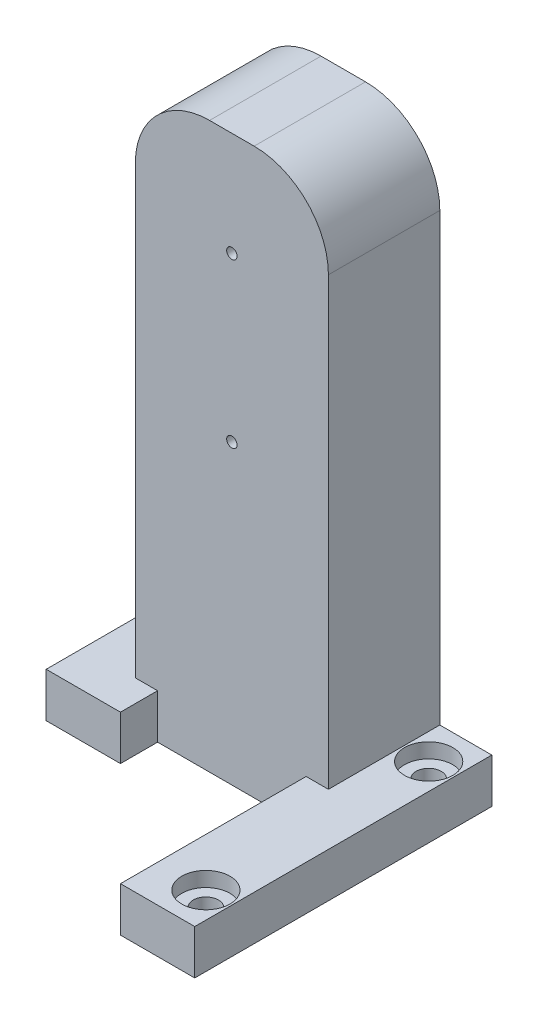
ISO-10303-21;
HEADER;
FILE_DESCRIPTION(('STEP AP214'),'2;1');
FILE_NAME('part.step','',(''),(''),'','','');
FILE_SCHEMA(('AUTOMOTIVE_DESIGN { 1 0 10303 214 1 1 1 1 }'));
ENDSEC;
DATA;
#1=APPLICATION_CONTEXT('core data for automotive mechanical design processes');
#2=APPLICATION_PROTOCOL_DEFINITION('international standard','automotive_design',2000,#1);
#3=PRODUCT_CONTEXT('',#1,'mechanical');
#4=PRODUCT('Part','Part','',(#3));
#5=PRODUCT_RELATED_PRODUCT_CATEGORY('part','',(#4));
#6=PRODUCT_DEFINITION_FORMATION('','',#4);
#7=PRODUCT_DEFINITION_CONTEXT('part definition',#1,'design');
#8=PRODUCT_DEFINITION('design','',#6,#7);
#9=PRODUCT_DEFINITION_SHAPE('','',#8);
#10=(LENGTH_UNIT() NAMED_UNIT(*) SI_UNIT(.MILLI.,.METRE.));
#11=(NAMED_UNIT(*) PLANE_ANGLE_UNIT() SI_UNIT($,.RADIAN.));
#12=(NAMED_UNIT(*) SI_UNIT($,.STERADIAN.) SOLID_ANGLE_UNIT());
#13=UNCERTAINTY_MEASURE_WITH_UNIT(LENGTH_MEASURE(1.E-05),#10,'distance_accuracy_value','');
#14=(GEOMETRIC_REPRESENTATION_CONTEXT(3) GLOBAL_UNCERTAINTY_ASSIGNED_CONTEXT((#13)) GLOBAL_UNIT_ASSIGNED_CONTEXT((#10,
#11,#12)) REPRESENTATION_CONTEXT('',''));
#15=CARTESIAN_POINT('',(0.,0.,0.));
#16=DIRECTION('',(0.,0.,1.));
#17=DIRECTION('',(1.,0.,0.));
#18=AXIS2_PLACEMENT_3D('',#15,#16,#17);
#19=CARTESIAN_POINT('',(-20.,0.,15.));
#20=DIRECTION('',(1.,0.,0.));
#21=DIRECTION('',(0.,0.,-1.));
#22=AXIS2_PLACEMENT_3D('',#19,#20,#21);
#23=PLANE('',#22);
#24=DIRECTION('',(0.,-1.,0.));
#25=VECTOR('',#24,1.);
#26=CARTESIAN_POINT('',(-20.,0.,0.));
#27=LINE('',#26,#25);
#28=CARTESIAN_POINT('',(-20.,6.,0.));
#29=VERTEX_POINT('',#28);
#30=CARTESIAN_POINT('',(-20.,0.,0.));
#31=VERTEX_POINT('',#30);
#32=EDGE_CURVE('E222',#29,#31,#27,.T.);
#33=ORIENTED_EDGE('',*,*,#32,.T.);
#34=DIRECTION('',(0.,0.,-1.));
#35=VECTOR('',#34,1.);
#36=CARTESIAN_POINT('',(-20.,0.,15.));
#37=LINE('',#36,#35);
#38=CARTESIAN_POINT('',(-20.,0.,20.));
#39=VERTEX_POINT('',#38);
#40=EDGE_CURVE('E201',#39,#31,#37,.T.);
#41=ORIENTED_EDGE('',*,*,#40,.F.);
#42=DIRECTION('',(0.,-1.,0.));
#43=VECTOR('',#42,1.);
#44=CARTESIAN_POINT('',(-20.,6.,20.));
#45=LINE('',#44,#43);
#46=CARTESIAN_POINT('',(-20.,6.,20.));
#47=VERTEX_POINT('',#46);
#48=EDGE_CURVE('E218',#47,#39,#45,.T.);
#49=ORIENTED_EDGE('',*,*,#48,.F.);
#50=DIRECTION('',(0.,0.,-1.));
#51=VECTOR('',#50,1.);
#52=CARTESIAN_POINT('',(-20.,6.,15.));
#53=LINE('',#52,#51);
#54=EDGE_CURVE('E242',#47,#29,#53,.T.);
#55=ORIENTED_EDGE('',*,*,#54,.T.);
#56=EDGE_LOOP('',(#33,#41,#49,#55));
#57=FACE_BOUND('',#56,.T.);
#58=ADVANCED_FACE('F39',(#57),#23,.F.);
#59=CARTESIAN_POINT('',(20.,0.,15.));
#60=DIRECTION('',(0.,1.,0.));
#61=DIRECTION('',(-1.,0.,0.));
#62=AXIS2_PLACEMENT_3D('',#59,#60,#61);
#63=PLANE('',#62);
#64=CARTESIAN_POINT('',(-16.5,0.,5.));
#65=DIRECTION('',(0.,1.,0.));
#66=DIRECTION('',(0.,0.,1.));
#67=AXIS2_PLACEMENT_3D('',#64,#65,#66);
#68=CIRCLE('',#67,1.70000000000001);
#69=CARTESIAN_POINT('',(-16.5,0.,6.70000000000001));
#70=VERTEX_POINT('',#69);
#71=EDGE_CURVE('E458',#70,#70,#68,.T.);
#72=ORIENTED_EDGE('',*,*,#71,.T.);
#73=EDGE_LOOP('',(#72));
#74=FACE_BOUND('',#73,.T.);
#75=CARTESIAN_POINT('',(16.5,0.,5.));
#76=DIRECTION('',(0.,1.,0.));
#77=DIRECTION('',(0.,0.,1.));
#78=AXIS2_PLACEMENT_3D('',#75,#76,#77);
#79=CIRCLE('',#78,1.70000000000001);
#80=CARTESIAN_POINT('',(16.5,0.,6.70000000000001));
#81=VERTEX_POINT('',#80);
#82=EDGE_CURVE('E442',#81,#81,#79,.T.);
#83=ORIENTED_EDGE('',*,*,#82,.T.);
#84=EDGE_LOOP('',(#83));
#85=FACE_BOUND('',#84,.T.);
#86=CARTESIAN_POINT('',(16.5,0.,35.));
#87=DIRECTION('',(0.,1.,0.));
#88=DIRECTION('',(0.,0.,1.));
#89=AXIS2_PLACEMENT_3D('',#86,#87,#88);
#90=CIRCLE('',#89,1.70000000000001);
#91=CARTESIAN_POINT('',(16.5,0.,36.7));
#92=VERTEX_POINT('',#91);
#93=EDGE_CURVE('E426',#92,#92,#90,.T.);
#94=ORIENTED_EDGE('',*,*,#93,.T.);
#95=EDGE_LOOP('',(#94));
#96=FACE_BOUND('',#95,.T.);
#97=DIRECTION('',(1.,0.,0.));
#98=VECTOR('',#97,1.);
#99=CARTESIAN_POINT('',(20.,0.,0.));
#100=LINE('',#99,#98);
#101=CARTESIAN_POINT('',(20.,0.,0.));
#102=VERTEX_POINT('',#101);
#103=EDGE_CURVE('E246',#31,#102,#100,.T.);
#104=ORIENTED_EDGE('',*,*,#103,.T.);
#105=DIRECTION('',(0.,0.,-1.));
#106=VECTOR('',#105,1.);
#107=CARTESIAN_POINT('',(20.,0.,15.));
#108=LINE('',#107,#106);
#109=CARTESIAN_POINT('',(20.,0.,40.));
#110=VERTEX_POINT('',#109);
#111=EDGE_CURVE('E155',#110,#102,#108,.T.);
#112=ORIENTED_EDGE('',*,*,#111,.F.);
#113=DIRECTION('',(-1.,0.,0.));
#114=VECTOR('',#113,1.);
#115=CARTESIAN_POINT('',(20.,0.,40.));
#116=LINE('',#115,#114);
#117=CARTESIAN_POINT('',(10.,0.,40.));
#118=VERTEX_POINT('',#117);
#119=EDGE_CURVE('E163',#110,#118,#116,.T.);
#120=ORIENTED_EDGE('',*,*,#119,.T.);
#121=DIRECTION('',(0.,0.,-1.));
#122=VECTOR('',#121,1.);
#123=CARTESIAN_POINT('',(10.,0.,40.));
#124=LINE('',#123,#122);
#125=CARTESIAN_POINT('',(10.,0.,15.));
#126=VERTEX_POINT('',#125);
#127=EDGE_CURVE('E174',#118,#126,#124,.T.);
#128=ORIENTED_EDGE('',*,*,#127,.T.);
#129=DIRECTION('',(1.,0.,0.));
#130=VECTOR('',#129,1.);
#131=CARTESIAN_POINT('',(0.,0.,15.));
#132=LINE('',#131,#130);
#133=CARTESIAN_POINT('',(-10.,0.,15.));
#134=VERTEX_POINT('',#133);
#135=EDGE_CURVE('E229',#134,#126,#132,.T.);
#136=ORIENTED_EDGE('',*,*,#135,.F.);
#137=DIRECTION('',(0.,0.,1.));
#138=VECTOR('',#137,1.);
#139=CARTESIAN_POINT('',(-10.,0.,15.));
#140=LINE('',#139,#138);
#141=CARTESIAN_POINT('',(-10.,0.,20.));
#142=VERTEX_POINT('',#141);
#143=EDGE_CURVE('E193',#134,#142,#140,.T.);
#144=ORIENTED_EDGE('',*,*,#143,.T.);
#145=DIRECTION('',(-1.,0.,0.));
#146=VECTOR('',#145,1.);
#147=CARTESIAN_POINT('',(-20.,0.,20.));
#148=LINE('',#147,#146);
#149=EDGE_CURVE('E207',#142,#39,#148,.T.);
#150=ORIENTED_EDGE('',*,*,#149,.T.);
#151=ORIENTED_EDGE('',*,*,#40,.T.);
#152=EDGE_LOOP('',(#104,#112,#120,#128,#136,#144,#150,#151));
#153=FACE_BOUND('',#152,.T.);
#154=ADVANCED_FACE('F323',(#74,#85,#96,#153),#63,.F.);
#155=CARTESIAN_POINT('',(20.,6.,15.));
#156=DIRECTION('',(-1.,0.,0.));
#157=DIRECTION('',(0.,0.,1.));
#158=AXIS2_PLACEMENT_3D('',#155,#156,#157);
#159=PLANE('',#158);
#160=DIRECTION('',(0.,1.,0.));
#161=VECTOR('',#160,1.);
#162=CARTESIAN_POINT('',(20.,6.,0.));
#163=LINE('',#162,#161);
#164=CARTESIAN_POINT('',(20.,6.,0.));
#165=VERTEX_POINT('',#164);
#166=EDGE_CURVE('E150',#102,#165,#163,.T.);
#167=ORIENTED_EDGE('',*,*,#166,.T.);
#168=DIRECTION('',(0.,0.,-1.));
#169=VECTOR('',#168,1.);
#170=CARTESIAN_POINT('',(20.,6.,15.));
#171=LINE('',#170,#169);
#172=CARTESIAN_POINT('',(20.,6.,40.));
#173=VERTEX_POINT('',#172);
#174=EDGE_CURVE('E143',#173,#165,#171,.T.);
#175=ORIENTED_EDGE('',*,*,#174,.F.);
#176=DIRECTION('',(0.,-1.,0.));
#177=VECTOR('',#176,1.);
#178=CARTESIAN_POINT('',(20.,6.,40.));
#179=LINE('',#178,#177);
#180=EDGE_CURVE('E147',#173,#110,#179,.T.);
#181=ORIENTED_EDGE('',*,*,#180,.T.);
#182=ORIENTED_EDGE('',*,*,#111,.T.);
#183=EDGE_LOOP('',(#167,#175,#181,#182));
#184=FACE_BOUND('',#183,.T.);
#185=ADVANCED_FACE('F145',(#184),#159,.F.);
#186=CARTESIAN_POINT('',(13.,6.,15.));
#187=DIRECTION('',(0.,-1.,0.));
#188=DIRECTION('',(1.,0.,0.));
#189=AXIS2_PLACEMENT_3D('',#186,#187,#188);
#190=PLANE('',#189);
#191=CARTESIAN_POINT('',(16.5,5.99999999999999,5.));
#192=DIRECTION('',(0.,1.,0.));
#193=DIRECTION('',(0.,0.,1.));
#194=AXIS2_PLACEMENT_3D('',#191,#192,#193);
#195=CIRCLE('',#194,3.25);
#196=CARTESIAN_POINT('',(16.5,5.99999999999999,8.25));
#197=VERTEX_POINT('',#196);
#198=EDGE_CURVE('E454',#197,#197,#195,.T.);
#199=ORIENTED_EDGE('',*,*,#198,.F.);
#200=EDGE_LOOP('',(#199));
#201=FACE_BOUND('',#200,.T.);
#202=CARTESIAN_POINT('',(16.5,5.99999999999999,35.));
#203=DIRECTION('',(0.,1.,0.));
#204=DIRECTION('',(0.,0.,1.));
#205=AXIS2_PLACEMENT_3D('',#202,#203,#204);
#206=CIRCLE('',#205,3.25);
#207=CARTESIAN_POINT('',(16.5,5.99999999999999,38.25));
#208=VERTEX_POINT('',#207);
#209=EDGE_CURVE('E438',#208,#208,#206,.T.);
#210=ORIENTED_EDGE('',*,*,#209,.F.);
#211=EDGE_LOOP('',(#210));
#212=FACE_BOUND('',#211,.T.);
#213=DIRECTION('',(-1.,0.,0.));
#214=VECTOR('',#213,1.);
#215=CARTESIAN_POINT('',(13.,6.,0.));
#216=LINE('',#215,#214);
#217=CARTESIAN_POINT('',(13.,6.,0.));
#218=VERTEX_POINT('',#217);
#219=EDGE_CURVE('E251',#165,#218,#216,.T.);
#220=ORIENTED_EDGE('',*,*,#219,.T.);
#221=DIRECTION('',(0.,0.,-1.));
#222=VECTOR('',#221,1.);
#223=CARTESIAN_POINT('',(13.,6.,15.));
#224=LINE('',#223,#222);
#225=CARTESIAN_POINT('',(13.,6.,15.));
#226=VERTEX_POINT('',#225);
#227=EDGE_CURVE('E156',#226,#218,#224,.T.);
#228=ORIENTED_EDGE('',*,*,#227,.F.);
#229=DIRECTION('',(1.,0.,0.));
#230=VECTOR('',#229,1.);
#231=CARTESIAN_POINT('',(20.,6.,15.));
#232=LINE('',#231,#230);
#233=CARTESIAN_POINT('',(10.,6.,15.));
#234=VERTEX_POINT('',#233);
#235=EDGE_CURVE('E166',#234,#226,#232,.T.);
#236=ORIENTED_EDGE('',*,*,#235,.F.);
#237=DIRECTION('',(0.,0.,-1.));
#238=VECTOR('',#237,1.);
#239=CARTESIAN_POINT('',(10.,6.,40.));
#240=LINE('',#239,#238);
#241=CARTESIAN_POINT('',(10.,6.,40.));
#242=VERTEX_POINT('',#241);
#243=EDGE_CURVE('E172',#242,#234,#240,.T.);
#244=ORIENTED_EDGE('',*,*,#243,.F.);
#245=DIRECTION('',(-1.,0.,0.));
#246=VECTOR('',#245,1.);
#247=CARTESIAN_POINT('',(20.,6.,40.));
#248=LINE('',#247,#246);
#249=EDGE_CURVE('E161',#173,#242,#248,.T.);
#250=ORIENTED_EDGE('',*,*,#249,.F.);
#251=ORIENTED_EDGE('',*,*,#174,.T.);
#252=EDGE_LOOP('',(#220,#228,#236,#244,#250,#251));
#253=FACE_BOUND('',#252,.T.);
#254=ADVANCED_FACE('F169',(#201,#212,#253),#190,.F.);
#255=CARTESIAN_POINT('',(13.,76.,15.));
#256=DIRECTION('',(-1.,0.,0.));
#257=DIRECTION('',(0.,-1.,0.));
#258=AXIS2_PLACEMENT_3D('',#255,#256,#257);
#259=PLANE('',#258);
#260=DIRECTION('',(0.,1.,0.));
#261=VECTOR('',#260,1.);
#262=CARTESIAN_POINT('',(13.,76.,0.));
#263=LINE('',#262,#261);
#264=CARTESIAN_POINT('',(13.,66.,0.));
#265=VERTEX_POINT('',#264);
#266=EDGE_CURVE('E254',#218,#265,#263,.T.);
#267=ORIENTED_EDGE('',*,*,#266,.T.);
#268=DIRECTION('',(0.,0.,-1.));
#269=VECTOR('',#268,1.);
#270=CARTESIAN_POINT('',(13.,66.,15.));
#271=LINE('',#270,#269);
#272=CARTESIAN_POINT('',(13.,66.,15.));
#273=VERTEX_POINT('',#272);
#274=EDGE_CURVE('E11',#265,#273,#271,.F.);
#275=ORIENTED_EDGE('',*,*,#274,.T.);
#276=DIRECTION('',(0.,1.,0.));
#277=VECTOR('',#276,1.);
#278=CARTESIAN_POINT('',(13.,76.,15.));
#279=LINE('',#278,#277);
#280=EDGE_CURVE('E232',#226,#273,#279,.T.);
#281=ORIENTED_EDGE('',*,*,#280,.F.);
#282=ORIENTED_EDGE('',*,*,#227,.T.);
#283=EDGE_LOOP('',(#267,#275,#281,#282));
#284=FACE_BOUND('',#283,.T.);
#285=ADVANCED_FACE('F319',(#284),#259,.F.);
#286=CARTESIAN_POINT('',(-13.,76.,15.));
#287=DIRECTION('',(0.,-1.,0.));
#288=DIRECTION('',(0.,0.,-1.));
#289=AXIS2_PLACEMENT_3D('',#286,#287,#288);
#290=PLANE('',#289);
#291=DIRECTION('',(-1.,0.,0.));
#292=VECTOR('',#291,1.);
#293=CARTESIAN_POINT('',(-13.,76.,0.));
#294=LINE('',#293,#292);
#295=CARTESIAN_POINT('',(2.99999999999999,76.,0.));
#296=VERTEX_POINT('',#295);
#297=CARTESIAN_POINT('',(-3.,76.,0.));
#298=VERTEX_POINT('',#297);
#299=EDGE_CURVE('E257',#296,#298,#294,.T.);
#300=ORIENTED_EDGE('',*,*,#299,.T.);
#301=DIRECTION('',(0.,0.,-1.));
#302=VECTOR('',#301,1.);
#303=CARTESIAN_POINT('',(-3.,76.,15.));
#304=LINE('',#303,#302);
#305=CARTESIAN_POINT('',(-3.,76.,15.));
#306=VERTEX_POINT('',#305);
#307=EDGE_CURVE('E61',#298,#306,#304,.F.);
#308=ORIENTED_EDGE('',*,*,#307,.T.);
#309=DIRECTION('',(-1.,0.,0.));
#310=VECTOR('',#309,1.);
#311=CARTESIAN_POINT('',(-13.,76.,15.));
#312=LINE('',#311,#310);
#313=CARTESIAN_POINT('',(2.99999999999999,76.,15.));
#314=VERTEX_POINT('',#313);
#315=EDGE_CURVE('E236',#314,#306,#312,.T.);
#316=ORIENTED_EDGE('',*,*,#315,.F.);
#317=DIRECTION('',(0.,0.,-1.));
#318=VECTOR('',#317,1.);
#319=CARTESIAN_POINT('',(2.99999999999999,76.,15.));
#320=LINE('',#319,#318);
#321=EDGE_CURVE('E289',#314,#296,#320,.T.);
#322=ORIENTED_EDGE('',*,*,#321,.T.);
#323=EDGE_LOOP('',(#300,#308,#316,#322));
#324=FACE_BOUND('',#323,.T.);
#325=ADVANCED_FACE('F314',(#324),#290,.F.);
#326=CARTESIAN_POINT('',(-13.,6.,15.));
#327=DIRECTION('',(1.,0.,0.));
#328=DIRECTION('',(0.,0.,-1.));
#329=AXIS2_PLACEMENT_3D('',#326,#327,#328);
#330=PLANE('',#329);
#331=DIRECTION('',(0.,-1.,0.));
#332=VECTOR('',#331,1.);
#333=CARTESIAN_POINT('',(-13.,6.,15.));
#334=LINE('',#333,#332);
#335=CARTESIAN_POINT('',(-13.,66.,15.));
#336=VERTEX_POINT('',#335);
#337=CARTESIAN_POINT('',(-13.,6.,15.));
#338=VERTEX_POINT('',#337);
#339=EDGE_CURVE('E239',#336,#338,#334,.T.);
#340=ORIENTED_EDGE('',*,*,#339,.F.);
#341=DIRECTION('',(0.,0.,-1.));
#342=VECTOR('',#341,1.);
#343=CARTESIAN_POINT('',(-13.,66.,15.));
#344=LINE('',#343,#342);
#345=CARTESIAN_POINT('',(-13.,66.,0.));
#346=VERTEX_POINT('',#345);
#347=EDGE_CURVE('E200',#336,#346,#344,.T.);
#348=ORIENTED_EDGE('',*,*,#347,.T.);
#349=DIRECTION('',(0.,-1.,0.));
#350=VECTOR('',#349,1.);
#351=CARTESIAN_POINT('',(-13.,6.,0.));
#352=LINE('',#351,#350);
#353=CARTESIAN_POINT('',(-13.,6.,0.));
#354=VERTEX_POINT('',#353);
#355=EDGE_CURVE('E260',#346,#354,#352,.T.);
#356=ORIENTED_EDGE('',*,*,#355,.T.);
#357=DIRECTION('',(0.,0.,-1.));
#358=VECTOR('',#357,1.);
#359=CARTESIAN_POINT('',(-13.,6.,15.));
#360=LINE('',#359,#358);
#361=EDGE_CURVE('E268',#338,#354,#360,.T.);
#362=ORIENTED_EDGE('',*,*,#361,.F.);
#363=EDGE_LOOP('',(#340,#348,#356,#362));
#364=FACE_BOUND('',#363,.T.);
#365=ADVANCED_FACE('F307',(#364),#330,.F.);
#366=CARTESIAN_POINT('',(-20.,6.,15.));
#367=DIRECTION('',(0.,-1.,0.));
#368=DIRECTION('',(1.,0.,0.));
#369=AXIS2_PLACEMENT_3D('',#366,#367,#368);
#370=PLANE('',#369);
#371=CARTESIAN_POINT('',(-16.5,6.,5.));
#372=DIRECTION('',(0.,1.,0.));
#373=DIRECTION('',(0.,0.,1.));
#374=AXIS2_PLACEMENT_3D('',#371,#372,#373);
#375=CIRCLE('',#374,3.25);
#376=CARTESIAN_POINT('',(-16.5,6.,8.25));
#377=VERTEX_POINT('',#376);
#378=EDGE_CURVE('E470',#377,#377,#375,.T.);
#379=ORIENTED_EDGE('',*,*,#378,.F.);
#380=EDGE_LOOP('',(#379));
#381=FACE_BOUND('',#380,.T.);
#382=DIRECTION('',(-1.,0.,0.));
#383=VECTOR('',#382,1.);
#384=CARTESIAN_POINT('',(-20.,6.,0.));
#385=LINE('',#384,#383);
#386=EDGE_CURVE('E233',#354,#29,#385,.T.);
#387=ORIENTED_EDGE('',*,*,#386,.T.);
#388=ORIENTED_EDGE('',*,*,#54,.F.);
#389=DIRECTION('',(-1.,0.,0.));
#390=VECTOR('',#389,1.);
#391=CARTESIAN_POINT('',(-20.,6.,20.));
#392=LINE('',#391,#390);
#393=CARTESIAN_POINT('',(-10.,6.,20.));
#394=VERTEX_POINT('',#393);
#395=EDGE_CURVE('E206',#394,#47,#392,.T.);
#396=ORIENTED_EDGE('',*,*,#395,.F.);
#397=DIRECTION('',(0.,0.,1.));
#398=VECTOR('',#397,1.);
#399=CARTESIAN_POINT('',(-10.,6.,15.));
#400=LINE('',#399,#398);
#401=CARTESIAN_POINT('',(-10.,6.,15.));
#402=VERTEX_POINT('',#401);
#403=EDGE_CURVE('E202',#402,#394,#400,.T.);
#404=ORIENTED_EDGE('',*,*,#403,.F.);
#405=DIRECTION('',(1.,0.,0.));
#406=VECTOR('',#405,1.);
#407=CARTESIAN_POINT('',(-20.,6.,15.));
#408=LINE('',#407,#406);
#409=EDGE_CURVE('E196',#338,#402,#408,.T.);
#410=ORIENTED_EDGE('',*,*,#409,.F.);
#411=ORIENTED_EDGE('',*,*,#361,.T.);
#412=EDGE_LOOP('',(#387,#388,#396,#404,#410,#411));
#413=FACE_BOUND('',#412,.T.);
#414=ADVANCED_FACE('F329',(#381,#413),#370,.F.);
#415=CARTESIAN_POINT('',(0.,0.,15.));
#416=DIRECTION('',(0.,0.,-1.));
#417=DIRECTION('',(-1.,0.,0.));
#418=AXIS2_PLACEMENT_3D('',#415,#416,#417);
#419=PLANE('',#418);
#420=CARTESIAN_POINT('',(0.,62.,15.));
#421=DIRECTION('',(0.,0.,1.));
#422=DIRECTION('',(1.,0.,0.));
#423=AXIS2_PLACEMENT_3D('',#420,#421,#422);
#424=CIRCLE('',#423,0.699999999999998);
#425=CARTESIAN_POINT('',(0.7,62.,15.));
#426=VERTEX_POINT('',#425);
#427=EDGE_CURVE('E420',#426,#426,#424,.T.);
#428=ORIENTED_EDGE('',*,*,#427,.F.);
#429=EDGE_LOOP('',(#428));
#430=FACE_BOUND('',#429,.T.);
#431=CARTESIAN_POINT('',(0.,40.,15.));
#432=DIRECTION('',(0.,0.,1.));
#433=DIRECTION('',(1.,0.,0.));
#434=AXIS2_PLACEMENT_3D('',#431,#432,#433);
#435=CIRCLE('',#434,0.699999999999998);
#436=CARTESIAN_POINT('',(0.700000000000003,40.,15.));
#437=VERTEX_POINT('',#436);
#438=EDGE_CURVE('E413',#437,#437,#435,.T.);
#439=ORIENTED_EDGE('',*,*,#438,.F.);
#440=EDGE_LOOP('',(#439));
#441=FACE_BOUND('',#440,.T.);
#442=ORIENTED_EDGE('',*,*,#315,.T.);
#443=CARTESIAN_POINT('',(-3.,66.,15.));
#444=DIRECTION('',(0.,0.,-1.));
#445=DIRECTION('',(-1.,0.,0.));
#446=AXIS2_PLACEMENT_3D('',#443,#444,#445);
#447=CIRCLE('',#446,10.);
#448=EDGE_CURVE('E48',#306,#336,#447,.F.);
#449=ORIENTED_EDGE('',*,*,#448,.T.);
#450=ORIENTED_EDGE('',*,*,#339,.T.);
#451=ORIENTED_EDGE('',*,*,#409,.T.);
#452=DIRECTION('',(0.,-1.,0.));
#453=VECTOR('',#452,1.);
#454=CARTESIAN_POINT('',(-10.,6.,15.));
#455=LINE('',#454,#453);
#456=EDGE_CURVE('E211',#402,#134,#455,.T.);
#457=ORIENTED_EDGE('',*,*,#456,.T.);
#458=ORIENTED_EDGE('',*,*,#135,.T.);
#459=DIRECTION('',(0.,-1.,0.));
#460=VECTOR('',#459,1.);
#461=CARTESIAN_POINT('',(10.,6.,15.));
#462=LINE('',#461,#460);
#463=EDGE_CURVE('E189',#234,#126,#462,.T.);
#464=ORIENTED_EDGE('',*,*,#463,.F.);
#465=ORIENTED_EDGE('',*,*,#235,.T.);
#466=ORIENTED_EDGE('',*,*,#280,.T.);
#467=CARTESIAN_POINT('',(2.99999999999999,66.,15.));
#468=DIRECTION('',(0.,0.,-1.));
#469=DIRECTION('',(-1.,0.,0.));
#470=AXIS2_PLACEMENT_3D('',#467,#468,#469);
#471=CIRCLE('',#470,10.);
#472=EDGE_CURVE('E295',#273,#314,#471,.F.);
#473=ORIENTED_EDGE('',*,*,#472,.T.);
#474=EDGE_LOOP('',(#442,#449,#450,#451,#457,#458,#464,#465,#466,#473));
#475=FACE_BOUND('',#474,.T.);
#476=ADVANCED_FACE('F301',(#430,#441,#475),#419,.F.);
#477=CARTESIAN_POINT('',(0.,0.,0.));
#478=DIRECTION('',(0.,0.,-1.));
#479=DIRECTION('',(-1.,0.,0.));
#480=AXIS2_PLACEMENT_3D('',#477,#478,#479);
#481=PLANE('',#480);
#482=CARTESIAN_POINT('',(0.,62.,0.));
#483=DIRECTION('',(0.,0.,1.));
#484=DIRECTION('',(1.,0.,0.));
#485=AXIS2_PLACEMENT_3D('',#482,#483,#484);
#486=CIRCLE('',#485,0.699999999999996);
#487=CARTESIAN_POINT('',(0.699999999999998,62.,0.));
#488=VERTEX_POINT('',#487);
#489=EDGE_CURVE('E416',#488,#488,#486,.T.);
#490=ORIENTED_EDGE('',*,*,#489,.T.);
#491=EDGE_LOOP('',(#490));
#492=FACE_BOUND('',#491,.T.);
#493=CARTESIAN_POINT('',(0.,40.,0.));
#494=DIRECTION('',(0.,0.,1.));
#495=DIRECTION('',(1.,0.,0.));
#496=AXIS2_PLACEMENT_3D('',#493,#494,#495);
#497=CIRCLE('',#496,0.699999999999996);
#498=CARTESIAN_POINT('',(0.700000000000001,40.,0.));
#499=VERTEX_POINT('',#498);
#500=EDGE_CURVE('E182',#499,#499,#497,.T.);
#501=ORIENTED_EDGE('',*,*,#500,.T.);
#502=EDGE_LOOP('',(#501));
#503=FACE_BOUND('',#502,.T.);
#504=ORIENTED_EDGE('',*,*,#355,.F.);
#505=CARTESIAN_POINT('',(-3.,66.,0.));
#506=DIRECTION('',(0.,0.,-1.));
#507=DIRECTION('',(-1.,0.,0.));
#508=AXIS2_PLACEMENT_3D('',#505,#506,#507);
#509=CIRCLE('',#508,10.);
#510=EDGE_CURVE('E286',#346,#298,#509,.T.);
#511=ORIENTED_EDGE('',*,*,#510,.T.);
#512=ORIENTED_EDGE('',*,*,#299,.F.);
#513=CARTESIAN_POINT('',(2.99999999999999,66.,0.));
#514=DIRECTION('',(0.,0.,-1.));
#515=DIRECTION('',(-1.,0.,0.));
#516=AXIS2_PLACEMENT_3D('',#513,#514,#515);
#517=CIRCLE('',#516,10.);
#518=EDGE_CURVE('E283',#296,#265,#517,.T.);
#519=ORIENTED_EDGE('',*,*,#518,.T.);
#520=ORIENTED_EDGE('',*,*,#266,.F.);
#521=ORIENTED_EDGE('',*,*,#219,.F.);
#522=ORIENTED_EDGE('',*,*,#166,.F.);
#523=ORIENTED_EDGE('',*,*,#103,.F.);
#524=ORIENTED_EDGE('',*,*,#32,.F.);
#525=ORIENTED_EDGE('',*,*,#386,.F.);
#526=EDGE_LOOP('',(#504,#511,#512,#519,#520,#521,#522,#523,#524,#525));
#527=FACE_BOUND('',#526,.T.);
#528=ADVANCED_FACE('F312',(#492,#503,#527),#481,.T.);
#529=CARTESIAN_POINT('',(-20.,6.,20.));
#530=DIRECTION('',(0.,0.,1.));
#531=DIRECTION('',(1.,0.,0.));
#532=AXIS2_PLACEMENT_3D('',#529,#530,#531);
#533=PLANE('',#532);
#534=ORIENTED_EDGE('',*,*,#149,.F.);
#535=DIRECTION('',(0.,-1.,0.));
#536=VECTOR('',#535,1.);
#537=CARTESIAN_POINT('',(-10.,6.,20.));
#538=LINE('',#537,#536);
#539=EDGE_CURVE('E223',#394,#142,#538,.T.);
#540=ORIENTED_EDGE('',*,*,#539,.F.);
#541=ORIENTED_EDGE('',*,*,#395,.T.);
#542=ORIENTED_EDGE('',*,*,#48,.T.);
#543=EDGE_LOOP('',(#534,#540,#541,#542));
#544=FACE_BOUND('',#543,.T.);
#545=ADVANCED_FACE('F345',(#544),#533,.T.);
#546=CARTESIAN_POINT('',(-10.,6.,15.));
#547=DIRECTION('',(1.,0.,0.));
#548=DIRECTION('',(0.,1.,0.));
#549=AXIS2_PLACEMENT_3D('',#546,#547,#548);
#550=PLANE('',#549);
#551=ORIENTED_EDGE('',*,*,#143,.F.);
#552=ORIENTED_EDGE('',*,*,#456,.F.);
#553=ORIENTED_EDGE('',*,*,#403,.T.);
#554=ORIENTED_EDGE('',*,*,#539,.T.);
#555=EDGE_LOOP('',(#551,#552,#553,#554));
#556=FACE_BOUND('',#555,.T.);
#557=ADVANCED_FACE('F337',(#556),#550,.T.);
#558=CARTESIAN_POINT('',(10.,6.,40.));
#559=DIRECTION('',(-1.,0.,0.));
#560=DIRECTION('',(0.,-1.,0.));
#561=AXIS2_PLACEMENT_3D('',#558,#559,#560);
#562=PLANE('',#561);
#563=ORIENTED_EDGE('',*,*,#127,.F.);
#564=DIRECTION('',(0.,-1.,0.));
#565=VECTOR('',#564,1.);
#566=CARTESIAN_POINT('',(10.,6.,40.));
#567=LINE('',#566,#565);
#568=EDGE_CURVE('E165',#242,#118,#567,.T.);
#569=ORIENTED_EDGE('',*,*,#568,.F.);
#570=ORIENTED_EDGE('',*,*,#243,.T.);
#571=ORIENTED_EDGE('',*,*,#463,.T.);
#572=EDGE_LOOP('',(#563,#569,#570,#571));
#573=FACE_BOUND('',#572,.T.);
#574=ADVANCED_FACE('F335',(#573),#562,.T.);
#575=CARTESIAN_POINT('',(20.,6.,40.));
#576=DIRECTION('',(0.,0.,1.));
#577=DIRECTION('',(1.,0.,0.));
#578=AXIS2_PLACEMENT_3D('',#575,#576,#577);
#579=PLANE('',#578);
#580=ORIENTED_EDGE('',*,*,#119,.F.);
#581=ORIENTED_EDGE('',*,*,#180,.F.);
#582=ORIENTED_EDGE('',*,*,#249,.T.);
#583=ORIENTED_EDGE('',*,*,#568,.T.);
#584=EDGE_LOOP('',(#580,#581,#582,#583));
#585=FACE_BOUND('',#584,.T.);
#586=ADVANCED_FACE('F160',(#585),#579,.T.);
#587=CARTESIAN_POINT('',(0.,40.,15.));
#588=DIRECTION('',(0.,0.,1.));
#589=DIRECTION('',(1.,0.,0.));
#590=AXIS2_PLACEMENT_3D('',#587,#588,#589);
#591=CYLINDRICAL_SURFACE('',#590,0.699999999999997);
#592=ORIENTED_EDGE('',*,*,#500,.F.);
#593=EDGE_LOOP('',(#592));
#594=FACE_BOUND('',#593,.T.);
#595=ORIENTED_EDGE('',*,*,#438,.T.);
#596=EDGE_LOOP('',(#595));
#597=FACE_BOUND('',#596,.T.);
#598=ADVANCED_FACE('F343',(#594,#597),#591,.F.);
#599=CARTESIAN_POINT('',(0.,62.,15.));
#600=DIRECTION('',(0.,0.,1.));
#601=DIRECTION('',(1.,0.,0.));
#602=AXIS2_PLACEMENT_3D('',#599,#600,#601);
#603=CYLINDRICAL_SURFACE('',#602,0.699999999999997);
#604=ORIENTED_EDGE('',*,*,#489,.F.);
#605=EDGE_LOOP('',(#604));
#606=FACE_BOUND('',#605,.T.);
#607=ORIENTED_EDGE('',*,*,#427,.T.);
#608=EDGE_LOOP('',(#607));
#609=FACE_BOUND('',#608,.T.);
#610=ADVANCED_FACE('F400',(#606,#609),#603,.F.);
#611=CARTESIAN_POINT('',(16.5,5.99999999999999,35.));
#612=DIRECTION('',(0.,1.,0.));
#613=DIRECTION('',(0.,0.,1.));
#614=AXIS2_PLACEMENT_3D('',#611,#612,#613);
#615=CYLINDRICAL_SURFACE('',#614,1.70000000000001);
#616=ORIENTED_EDGE('',*,*,#93,.F.);
#617=EDGE_LOOP('',(#616));
#618=FACE_BOUND('',#617,.T.);
#619=CARTESIAN_POINT('',(16.5,3.99999999999999,35.));
#620=DIRECTION('',(0.,1.,0.));
#621=DIRECTION('',(0.,0.,1.));
#622=AXIS2_PLACEMENT_3D('',#619,#620,#621);
#623=CIRCLE('',#622,1.7);
#624=CARTESIAN_POINT('',(16.5,3.99999999999999,36.7));
#625=VERTEX_POINT('',#624);
#626=EDGE_CURVE('E430',#625,#625,#623,.T.);
#627=ORIENTED_EDGE('',*,*,#626,.T.);
#628=EDGE_LOOP('',(#627));
#629=FACE_BOUND('',#628,.T.);
#630=ADVANCED_FACE('F396',(#618,#629),#615,.F.);
#631=CARTESIAN_POINT('',(18.2,3.99999999999999,35.));
#632=DIRECTION('',(0.,-1.,0.));
#633=DIRECTION('',(0.,0.,-1.));
#634=AXIS2_PLACEMENT_3D('',#631,#632,#633);
#635=PLANE('',#634);
#636=ORIENTED_EDGE('',*,*,#626,.F.);
#637=EDGE_LOOP('',(#636));
#638=FACE_BOUND('',#637,.T.);
#639=CARTESIAN_POINT('',(16.5,3.99999999999999,35.));
#640=DIRECTION('',(0.,1.,0.));
#641=DIRECTION('',(0.,0.,1.));
#642=AXIS2_PLACEMENT_3D('',#639,#640,#641);
#643=CIRCLE('',#642,3.25);
#644=CARTESIAN_POINT('',(16.5,3.99999999999999,38.25));
#645=VERTEX_POINT('',#644);
#646=EDGE_CURVE('E434',#645,#645,#643,.T.);
#647=ORIENTED_EDGE('',*,*,#646,.T.);
#648=EDGE_LOOP('',(#647));
#649=FACE_BOUND('',#648,.T.);
#650=ADVANCED_FACE('F392',(#638,#649),#635,.F.);
#651=CARTESIAN_POINT('',(16.5,5.99999999999999,35.));
#652=DIRECTION('',(0.,1.,0.));
#653=DIRECTION('',(0.,0.,1.));
#654=AXIS2_PLACEMENT_3D('',#651,#652,#653);
#655=CYLINDRICAL_SURFACE('',#654,3.25);
#656=ORIENTED_EDGE('',*,*,#646,.F.);
#657=EDGE_LOOP('',(#656));
#658=FACE_BOUND('',#657,.T.);
#659=ORIENTED_EDGE('',*,*,#209,.T.);
#660=EDGE_LOOP('',(#659));
#661=FACE_BOUND('',#660,.T.);
#662=ADVANCED_FACE('F388',(#658,#661),#655,.F.);
#663=CARTESIAN_POINT('',(16.5,5.99999999999999,5.));
#664=DIRECTION('',(0.,1.,0.));
#665=DIRECTION('',(0.,0.,1.));
#666=AXIS2_PLACEMENT_3D('',#663,#664,#665);
#667=CYLINDRICAL_SURFACE('',#666,1.70000000000001);
#668=ORIENTED_EDGE('',*,*,#82,.F.);
#669=EDGE_LOOP('',(#668));
#670=FACE_BOUND('',#669,.T.);
#671=CARTESIAN_POINT('',(16.5,3.99999999999999,5.));
#672=DIRECTION('',(0.,1.,0.));
#673=DIRECTION('',(0.,0.,1.));
#674=AXIS2_PLACEMENT_3D('',#671,#672,#673);
#675=CIRCLE('',#674,1.7);
#676=CARTESIAN_POINT('',(16.5,3.99999999999999,6.7));
#677=VERTEX_POINT('',#676);
#678=EDGE_CURVE('E446',#677,#677,#675,.T.);
#679=ORIENTED_EDGE('',*,*,#678,.T.);
#680=EDGE_LOOP('',(#679));
#681=FACE_BOUND('',#680,.T.);
#682=ADVANCED_FACE('F384',(#670,#681),#667,.F.);
#683=CARTESIAN_POINT('',(18.2,3.99999999999999,5.));
#684=DIRECTION('',(0.,-1.,0.));
#685=DIRECTION('',(0.,0.,-1.));
#686=AXIS2_PLACEMENT_3D('',#683,#684,#685);
#687=PLANE('',#686);
#688=ORIENTED_EDGE('',*,*,#678,.F.);
#689=EDGE_LOOP('',(#688));
#690=FACE_BOUND('',#689,.T.);
#691=CARTESIAN_POINT('',(16.5,3.99999999999999,5.));
#692=DIRECTION('',(0.,1.,0.));
#693=DIRECTION('',(0.,0.,1.));
#694=AXIS2_PLACEMENT_3D('',#691,#692,#693);
#695=CIRCLE('',#694,3.25);
#696=CARTESIAN_POINT('',(16.5,3.99999999999999,8.25));
#697=VERTEX_POINT('',#696);
#698=EDGE_CURVE('E450',#697,#697,#695,.T.);
#699=ORIENTED_EDGE('',*,*,#698,.T.);
#700=EDGE_LOOP('',(#699));
#701=FACE_BOUND('',#700,.T.);
#702=ADVANCED_FACE('F380',(#690,#701),#687,.F.);
#703=CARTESIAN_POINT('',(16.5,5.99999999999999,5.));
#704=DIRECTION('',(0.,1.,0.));
#705=DIRECTION('',(0.,0.,1.));
#706=AXIS2_PLACEMENT_3D('',#703,#704,#705);
#707=CYLINDRICAL_SURFACE('',#706,3.25);
#708=ORIENTED_EDGE('',*,*,#698,.F.);
#709=EDGE_LOOP('',(#708));
#710=FACE_BOUND('',#709,.T.);
#711=ORIENTED_EDGE('',*,*,#198,.T.);
#712=EDGE_LOOP('',(#711));
#713=FACE_BOUND('',#712,.T.);
#714=ADVANCED_FACE('F376',(#710,#713),#707,.F.);
#715=CARTESIAN_POINT('',(-16.5,6.,5.));
#716=DIRECTION('',(0.,1.,0.));
#717=DIRECTION('',(0.,0.,1.));
#718=AXIS2_PLACEMENT_3D('',#715,#716,#717);
#719=CYLINDRICAL_SURFACE('',#718,1.70000000000001);
#720=ORIENTED_EDGE('',*,*,#71,.F.);
#721=EDGE_LOOP('',(#720));
#722=FACE_BOUND('',#721,.T.);
#723=CARTESIAN_POINT('',(-16.5,4.,5.));
#724=DIRECTION('',(0.,1.,0.));
#725=DIRECTION('',(0.,0.,1.));
#726=AXIS2_PLACEMENT_3D('',#723,#724,#725);
#727=CIRCLE('',#726,1.7);
#728=CARTESIAN_POINT('',(-16.5,4.,6.7));
#729=VERTEX_POINT('',#728);
#730=EDGE_CURVE('E462',#729,#729,#727,.T.);
#731=ORIENTED_EDGE('',*,*,#730,.T.);
#732=EDGE_LOOP('',(#731));
#733=FACE_BOUND('',#732,.T.);
#734=ADVANCED_FACE('F368',(#722,#733),#719,.F.);
#735=CARTESIAN_POINT('',(-14.8,4.,5.));
#736=DIRECTION('',(0.,-1.,0.));
#737=DIRECTION('',(0.,0.,-1.));
#738=AXIS2_PLACEMENT_3D('',#735,#736,#737);
#739=PLANE('',#738);
#740=ORIENTED_EDGE('',*,*,#730,.F.);
#741=EDGE_LOOP('',(#740));
#742=FACE_BOUND('',#741,.T.);
#743=CARTESIAN_POINT('',(-16.5,4.,5.));
#744=DIRECTION('',(0.,1.,0.));
#745=DIRECTION('',(0.,0.,1.));
#746=AXIS2_PLACEMENT_3D('',#743,#744,#745);
#747=CIRCLE('',#746,3.25);
#748=CARTESIAN_POINT('',(-16.5,4.,8.25));
#749=VERTEX_POINT('',#748);
#750=EDGE_CURVE('E466',#749,#749,#747,.T.);
#751=ORIENTED_EDGE('',*,*,#750,.T.);
#752=EDGE_LOOP('',(#751));
#753=FACE_BOUND('',#752,.T.);
#754=ADVANCED_FACE('F362',(#742,#753),#739,.F.);
#755=CARTESIAN_POINT('',(-16.5,6.,5.));
#756=DIRECTION('',(0.,1.,0.));
#757=DIRECTION('',(0.,0.,1.));
#758=AXIS2_PLACEMENT_3D('',#755,#756,#757);
#759=CYLINDRICAL_SURFACE('',#758,3.25);
#760=ORIENTED_EDGE('',*,*,#750,.F.);
#761=EDGE_LOOP('',(#760));
#762=FACE_BOUND('',#761,.T.);
#763=ORIENTED_EDGE('',*,*,#378,.T.);
#764=EDGE_LOOP('',(#763));
#765=FACE_BOUND('',#764,.T.);
#766=ADVANCED_FACE('F357',(#762,#765),#759,.F.);
#767=CARTESIAN_POINT('',(-3.,66.,15.));
#768=DIRECTION('',(0.,0.,-1.));
#769=DIRECTION('',(-1.,0.,0.));
#770=AXIS2_PLACEMENT_3D('',#767,#768,#769);
#771=CYLINDRICAL_SURFACE('',#770,10.);
#772=ORIENTED_EDGE('',*,*,#448,.F.);
#773=ORIENTED_EDGE('',*,*,#307,.F.);
#774=ORIENTED_EDGE('',*,*,#510,.F.);
#775=ORIENTED_EDGE('',*,*,#347,.F.);
#776=EDGE_LOOP('',(#772,#773,#774,#775));
#777=FACE_BOUND('',#776,.T.);
#778=ADVANCED_FACE('F309',(#777),#771,.T.);
#779=CARTESIAN_POINT('',(2.99999999999999,66.,15.));
#780=DIRECTION('',(0.,0.,-1.));
#781=DIRECTION('',(-1.,0.,0.));
#782=AXIS2_PLACEMENT_3D('',#779,#780,#781);
#783=CYLINDRICAL_SURFACE('',#782,10.);
#784=ORIENTED_EDGE('',*,*,#472,.F.);
#785=ORIENTED_EDGE('',*,*,#274,.F.);
#786=ORIENTED_EDGE('',*,*,#518,.F.);
#787=ORIENTED_EDGE('',*,*,#321,.F.);
#788=EDGE_LOOP('',(#784,#785,#786,#787));
#789=FACE_BOUND('',#788,.T.);
#790=ADVANCED_FACE('F41',(#789),#783,.T.);
#791=CLOSED_SHELL('',(#58,#154,#185,#254,#285,#325,#365,#414,#476,#528,#545,#557,#574,#586,#598,
#610,#630,#650,#662,#682,#702,#714,#734,#754,#766,#778,#790));
#792=MANIFOLD_SOLID_BREP('B2',#791);
#793=ADVANCED_BREP_SHAPE_REPRESENTATION('',(#18,#792),#14);
#794=SHAPE_DEFINITION_REPRESENTATION(#9,#793);
ENDSEC;
END-ISO-10303-21;
